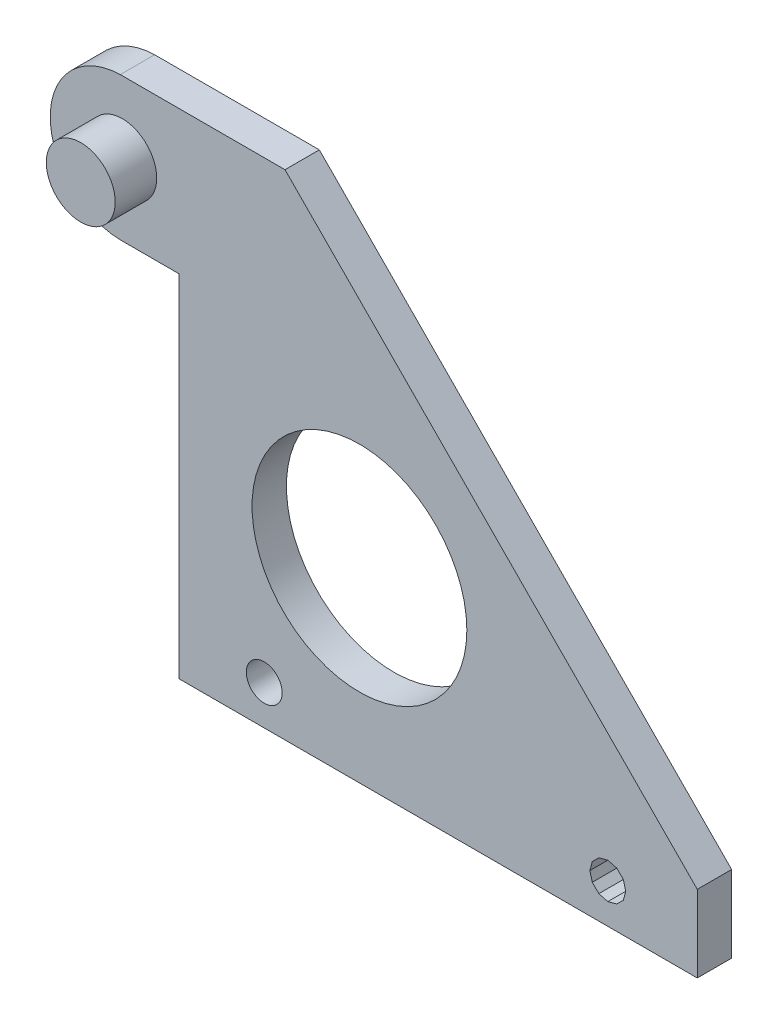
ISO-10303-21;
HEADER;
FILE_DESCRIPTION(('STEP AP214'),'2;1');
FILE_NAME('part.step','',(''),(''),'','','');
FILE_SCHEMA(('AUTOMOTIVE_DESIGN { 1 0 10303 214 1 1 1 1 }'));
ENDSEC;
DATA;
#1=APPLICATION_CONTEXT('core data for automotive mechanical design processes');
#2=APPLICATION_PROTOCOL_DEFINITION('international standard','automotive_design',2000,#1);
#3=PRODUCT_CONTEXT('',#1,'mechanical');
#4=PRODUCT('Part','Part','',(#3));
#5=PRODUCT_RELATED_PRODUCT_CATEGORY('part','',(#4));
#6=PRODUCT_DEFINITION_FORMATION('','',#4);
#7=PRODUCT_DEFINITION_CONTEXT('part definition',#1,'design');
#8=PRODUCT_DEFINITION('design','',#6,#7);
#9=PRODUCT_DEFINITION_SHAPE('','',#8);
#10=(LENGTH_UNIT() NAMED_UNIT(*) SI_UNIT(.MILLI.,.METRE.));
#11=(NAMED_UNIT(*) PLANE_ANGLE_UNIT() SI_UNIT($,.RADIAN.));
#12=(NAMED_UNIT(*) SI_UNIT($,.STERADIAN.) SOLID_ANGLE_UNIT());
#13=UNCERTAINTY_MEASURE_WITH_UNIT(LENGTH_MEASURE(1.E-05),#10,'distance_accuracy_value','');
#14=(GEOMETRIC_REPRESENTATION_CONTEXT(3) GLOBAL_UNCERTAINTY_ASSIGNED_CONTEXT((#13)) GLOBAL_UNIT_ASSIGNED_CONTEXT((#10,
#11,#12)) REPRESENTATION_CONTEXT('',''));
#15=CARTESIAN_POINT('',(0.,0.,0.));
#16=DIRECTION('',(0.,0.,1.));
#17=DIRECTION('',(1.,0.,0.));
#18=AXIS2_PLACEMENT_3D('',#15,#16,#17);
#19=CARTESIAN_POINT('',(-56.2999993562698,-5.49999997019768,0.));
#20=DIRECTION('',(-1.,0.,0.));
#21=DIRECTION('',(0.,0.,1.));
#22=AXIS2_PLACEMENT_3D('',#19,#20,#21);
#23=PLANE('',#22);
#24=DIRECTION('',(0.,-1.,0.));
#25=VECTOR('',#24,1.);
#26=CARTESIAN_POINT('',(-56.2999993562698,-5.49999997019768,2.40000011399388));
#27=LINE('',#26,#25);
#28=CARTESIAN_POINT('',(-56.2999993562698,-5.49999997019768,2.40000011399388));
#29=VERTEX_POINT('',#28);
#30=CARTESIAN_POINT('',(-56.2999993562698,-29.9999993294477,2.40000011399388));
#31=VERTEX_POINT('',#30);
#32=EDGE_CURVE('E348',#29,#31,#27,.T.);
#33=ORIENTED_EDGE('',*,*,#32,.F.);
#34=DIRECTION('',(0.,0.,1.));
#35=VECTOR('',#34,1.);
#36=CARTESIAN_POINT('',(-56.2999993562698,-5.49999997019768,0.));
#37=LINE('',#36,#35);
#38=CARTESIAN_POINT('',(-56.2999993562698,-5.49999997019768,0.));
#39=VERTEX_POINT('',#38);
#40=EDGE_CURVE('E11',#39,#29,#37,.T.);
#41=ORIENTED_EDGE('',*,*,#40,.F.);
#42=DIRECTION('',(0.,-1.,0.));
#43=VECTOR('',#42,1.);
#44=CARTESIAN_POINT('',(-56.2999993562698,-5.49999997019768,0.));
#45=LINE('',#44,#43);
#46=CARTESIAN_POINT('',(-56.2999993562698,-29.9999993294477,0.));
#47=VERTEX_POINT('',#46);
#48=EDGE_CURVE('E360',#39,#47,#45,.T.);
#49=ORIENTED_EDGE('',*,*,#48,.T.);
#50=DIRECTION('',(0.,0.,-1.));
#51=VECTOR('',#50,1.);
#52=CARTESIAN_POINT('',(-56.2999993562698,-29.9999993294477,0.));
#53=LINE('',#52,#51);
#54=EDGE_CURVE('E317',#31,#47,#53,.T.);
#55=ORIENTED_EDGE('',*,*,#54,.F.);
#56=EDGE_LOOP('',(#33,#41,#49,#55));
#57=FACE_BOUND('',#56,.T.);
#58=ADVANCED_FACE('F38',(#57),#23,.T.);
#59=CARTESIAN_POINT('',(-60.4056119918823,-5.49999997019768,0.));
#60=DIRECTION('',(0.,-1.,0.));
#61=DIRECTION('',(1.,0.,0.));
#62=AXIS2_PLACEMENT_3D('',#59,#60,#61);
#63=PLANE('',#62);
#64=DIRECTION('',(1.,0.,0.));
#65=VECTOR('',#64,1.);
#66=CARTESIAN_POINT('',(-60.4056119918823,-5.49999997019768,2.40000011399388));
#67=LINE('',#66,#65);
#68=CARTESIAN_POINT('',(-60.4056119918823,-5.49999997019768,2.40000011399388));
#69=VERTEX_POINT('',#68);
#70=EDGE_CURVE('E373',#69,#29,#67,.T.);
#71=ORIENTED_EDGE('',*,*,#70,.F.);
#72=DIRECTION('',(0.,0.,1.));
#73=VECTOR('',#72,1.);
#74=CARTESIAN_POINT('',(-60.4056119918823,-5.49999997019768,0.));
#75=LINE('',#74,#73);
#76=CARTESIAN_POINT('',(-60.4056119918823,-5.49999997019768,0.));
#77=VERTEX_POINT('',#76);
#78=EDGE_CURVE('E48',#77,#69,#75,.T.);
#79=ORIENTED_EDGE('',*,*,#78,.F.);
#80=DIRECTION('',(1.,0.,0.));
#81=VECTOR('',#80,1.);
#82=CARTESIAN_POINT('',(-60.4056119918823,-5.49999997019768,0.));
#83=LINE('',#82,#81);
#84=EDGE_CURVE('E356',#77,#39,#83,.T.);
#85=ORIENTED_EDGE('',*,*,#84,.T.);
#86=ORIENTED_EDGE('',*,*,#40,.T.);
#87=EDGE_LOOP('',(#71,#79,#85,#86));
#88=FACE_BOUND('',#87,.T.);
#89=ADVANCED_FACE('F421',(#88),#63,.T.);
#90=CARTESIAN_POINT('',(-60.2988634097059,-0.500000081956387,0.));
#91=DIRECTION('',(0.,0.,1.));
#92=DIRECTION('',(1.,0.,0.));
#93=AXIS2_PLACEMENT_3D('',#90,#91,#92);
#94=CYLINDRICAL_SURFACE('',#93,5.00113928442406);
#95=CARTESIAN_POINT('',(-60.2988634097059,-0.500000081956387,2.40000011399388));
#96=DIRECTION('',(0.,0.,1.));
#97=DIRECTION('',(1.,0.,0.));
#98=AXIS2_PLACEMENT_3D('',#95,#96,#97);
#99=CIRCLE('',#98,5.00113928442406);
#100=CARTESIAN_POINT('',(-60.4056119918823,4.4999998062849,2.40000011399388));
#101=VERTEX_POINT('',#100);
#102=EDGE_CURVE('E369',#101,#69,#99,.T.);
#103=ORIENTED_EDGE('',*,*,#102,.F.);
#104=DIRECTION('',(0.,0.,1.));
#105=VECTOR('',#104,1.);
#106=CARTESIAN_POINT('',(-60.4056119918823,4.4999998062849,0.));
#107=LINE('',#106,#105);
#108=CARTESIAN_POINT('',(-60.4056119918823,4.4999998062849,0.));
#109=VERTEX_POINT('',#108);
#110=EDGE_CURVE('E381',#109,#101,#107,.T.);
#111=ORIENTED_EDGE('',*,*,#110,.F.);
#112=CARTESIAN_POINT('',(-60.2988634097059,-0.500000081956387,0.));
#113=DIRECTION('',(0.,0.,1.));
#114=DIRECTION('',(1.,0.,0.));
#115=AXIS2_PLACEMENT_3D('',#112,#113,#114);
#116=CIRCLE('',#115,5.00113928442406);
#117=EDGE_CURVE('E352',#109,#77,#116,.T.);
#118=ORIENTED_EDGE('',*,*,#117,.T.);
#119=ORIENTED_EDGE('',*,*,#78,.T.);
#120=EDGE_LOOP('',(#103,#111,#118,#119));
#121=FACE_BOUND('',#120,.T.);
#122=ADVANCED_FACE('F418',(#121),#94,.T.);
#123=CARTESIAN_POINT('',(-48.9003583788872,4.4999998062849,0.));
#124=DIRECTION('',(0.,1.,0.));
#125=DIRECTION('',(0.,0.,1.));
#126=AXIS2_PLACEMENT_3D('',#123,#124,#125);
#127=PLANE('',#126);
#128=DIRECTION('',(-1.,0.,0.));
#129=VECTOR('',#128,1.);
#130=CARTESIAN_POINT('',(-48.9003583788872,4.4999998062849,2.40000011399388));
#131=LINE('',#130,#129);
#132=CARTESIAN_POINT('',(-48.9003583788872,4.4999998062849,2.40000011399388));
#133=VERTEX_POINT('',#132);
#134=EDGE_CURVE('E366',#133,#101,#131,.T.);
#135=ORIENTED_EDGE('',*,*,#134,.F.);
#136=DIRECTION('',(0.,0.,1.));
#137=VECTOR('',#136,1.);
#138=CARTESIAN_POINT('',(-48.9003583788872,4.4999998062849,0.));
#139=LINE('',#138,#137);
#140=CARTESIAN_POINT('',(-48.9003583788872,4.4999998062849,0.));
#141=VERTEX_POINT('',#140);
#142=EDGE_CURVE('E383',#141,#133,#139,.T.);
#143=ORIENTED_EDGE('',*,*,#142,.F.);
#144=DIRECTION('',(-1.,0.,0.));
#145=VECTOR('',#144,1.);
#146=CARTESIAN_POINT('',(-48.9003583788872,4.4999998062849,0.));
#147=LINE('',#146,#145);
#148=EDGE_CURVE('E347',#141,#109,#147,.T.);
#149=ORIENTED_EDGE('',*,*,#148,.T.);
#150=ORIENTED_EDGE('',*,*,#110,.T.);
#151=EDGE_LOOP('',(#135,#143,#149,#150));
#152=FACE_BOUND('',#151,.T.);
#153=ADVANCED_FACE('F411',(#152),#127,.T.);
#154=CARTESIAN_POINT('',(-20.1000012457371,-24.6347561478615,0.));
#155=DIRECTION('',(0.711176322679684,0.703013682697429,0.));
#156=DIRECTION('',(-0.703013682697429,0.711176322679684,0.));
#157=AXIS2_PLACEMENT_3D('',#154,#155,#156);
#158=PLANE('',#157);
#159=DIRECTION('',(-0.703013682697429,0.711176322679684,0.));
#160=VECTOR('',#159,1.);
#161=CARTESIAN_POINT('',(-20.1000012457371,-24.6347561478615,2.40000011399388));
#162=LINE('',#161,#160);
#163=CARTESIAN_POINT('',(-20.1000012457371,-24.6347561478615,2.40000011399388));
#164=VERTEX_POINT('',#163);
#165=EDGE_CURVE('E342',#164,#133,#162,.T.);
#166=ORIENTED_EDGE('',*,*,#165,.F.);
#167=DIRECTION('',(0.,0.,1.));
#168=VECTOR('',#167,1.);
#169=CARTESIAN_POINT('',(-20.1000012457371,-24.6347561478615,0.));
#170=LINE('',#169,#168);
#171=CARTESIAN_POINT('',(-20.1000012457371,-24.6347561478615,0.));
#172=VERTEX_POINT('',#171);
#173=EDGE_CURVE('E42',#172,#164,#170,.T.);
#174=ORIENTED_EDGE('',*,*,#173,.F.);
#175=DIRECTION('',(-0.703013682697429,0.711176322679684,0.));
#176=VECTOR('',#175,1.);
#177=CARTESIAN_POINT('',(-20.1000012457371,-24.6347561478615,0.));
#178=LINE('',#177,#176);
#179=EDGE_CURVE('E343',#172,#141,#178,.T.);
#180=ORIENTED_EDGE('',*,*,#179,.T.);
#181=ORIENTED_EDGE('',*,*,#142,.T.);
#182=EDGE_LOOP('',(#166,#174,#180,#181));
#183=FACE_BOUND('',#182,.T.);
#184=ADVANCED_FACE('F40',(#183),#158,.T.);
#185=CARTESIAN_POINT('',(-60.2988634097059,-0.500000081956387,0.));
#186=DIRECTION('',(0.,0.,1.));
#187=DIRECTION('',(1.,0.,0.));
#188=AXIS2_PLACEMENT_3D('',#185,#186,#187);
#189=PLANE('',#188);
#190=CARTESIAN_POINT('',(-50.3500010818243,-27.2502419436914,0.));
#191=DIRECTION('',(0.,0.,-1.));
#192=DIRECTION('',(-1.,0.,0.));
#193=AXIS2_PLACEMENT_3D('',#190,#191,#192);
#194=CIRCLE('',#193,1.25275879254651);
#195=CARTESIAN_POINT('',(-51.6027598743708,-27.2502419436914,0.));
#196=VERTEX_POINT('',#195);
#197=EDGE_CURVE('E202',#196,#196,#194,.T.);
#198=ORIENTED_EDGE('',*,*,#197,.F.);
#199=EDGE_LOOP('',(#198));
#200=FACE_BOUND('',#199,.T.);
#201=DIRECTION('',(0.707105346446154,-0.70710821592403,0.));
#202=VECTOR('',#201,1.);
#203=CARTESIAN_POINT('',(-27.4349991232157,-27.8759989887476,0.));
#204=LINE('',#203,#202);
#205=CARTESIAN_POINT('',(-27.4349991232157,-27.8759989887476,0.));
#206=VERTEX_POINT('',#205);
#207=CARTESIAN_POINT('',(-26.9760005176067,-28.3349994570017,0.));
#208=VERTEX_POINT('',#207);
#209=EDGE_CURVE('E180',#206,#208,#204,.T.);
#210=ORIENTED_EDGE('',*,*,#209,.T.);
#211=DIRECTION('',(0.965823467607934,-0.259200751190628,0.));
#212=VECTOR('',#211,1.);
#213=CARTESIAN_POINT('',(-26.9760005176067,-28.3349994570017,0.));
#214=LINE('',#213,#212);
#215=CARTESIAN_POINT('',(-26.350000873208,-28.5030007362366,0.));
#216=VERTEX_POINT('',#215);
#217=EDGE_CURVE('E173',#208,#216,#214,.T.);
#218=ORIENTED_EDGE('',*,*,#217,.T.);
#219=DIRECTION('',(0.965823467607934,0.259200751190628,0.));
#220=VECTOR('',#219,1.);
#221=CARTESIAN_POINT('',(-26.350000873208,-28.5030007362366,0.));
#222=LINE('',#221,#220);
#223=CARTESIAN_POINT('',(-25.7240012288094,-28.3349994570017,0.));
#224=VERTEX_POINT('',#223);
#225=EDGE_CURVE('E183',#216,#224,#222,.T.);
#226=ORIENTED_EDGE('',*,*,#225,.T.);
#227=DIRECTION('',(0.707108215918207,0.707105346451977,0.));
#228=VECTOR('',#227,1.);
#229=CARTESIAN_POINT('',(-25.7240012288094,-28.3349994570017,0.));
#230=LINE('',#229,#228);
#231=CARTESIAN_POINT('',(-25.2649988979101,-27.8759989887476,0.));
#232=VERTEX_POINT('',#231);
#233=EDGE_CURVE('E56',#224,#232,#230,.T.);
#234=ORIENTED_EDGE('',*,*,#233,.T.);
#235=DIRECTION('',(0.25919807048093,0.965824187033522,0.));
#236=VECTOR('',#235,1.);
#237=CARTESIAN_POINT('',(-25.2649988979101,-27.8759989887476,0.));
#238=LINE('',#237,#236);
#239=CARTESIAN_POINT('',(-25.0969994813204,-27.2499993443489,0.));
#240=VERTEX_POINT('',#239);
#241=EDGE_CURVE('E207',#232,#240,#238,.T.);
#242=ORIENTED_EDGE('',*,*,#241,.T.);
#243=DIRECTION('',(-0.25919807048093,0.965824187033522,0.));
#244=VECTOR('',#243,1.);
#245=CARTESIAN_POINT('',(-25.0969994813204,-27.2499993443489,0.));
#246=LINE('',#245,#244);
#247=CARTESIAN_POINT('',(-25.2649988979101,-26.6239996999502,0.));
#248=VERTEX_POINT('',#247);
#249=EDGE_CURVE('E211',#240,#248,#246,.T.);
#250=ORIENTED_EDGE('',*,*,#249,.T.);
#251=DIRECTION('',(-0.707109650652778,0.707103911708672,0.));
#252=VECTOR('',#251,1.);
#253=CARTESIAN_POINT('',(-25.2649988979101,-26.6239996999502,0.));
#254=LINE('',#253,#252);
#255=CARTESIAN_POINT('',(-25.7240012288094,-26.1650010943413,0.));
#256=VERTEX_POINT('',#255);
#257=EDGE_CURVE('E215',#248,#256,#254,.T.);
#258=ORIENTED_EDGE('',*,*,#257,.T.);
#259=DIRECTION('',(-0.966208881366902,0.257760349099157,0.));
#260=VECTOR('',#259,1.);
#261=CARTESIAN_POINT('',(-25.7240012288094,-26.1650010943413,0.));
#262=LINE('',#261,#260);
#263=CARTESIAN_POINT('',(-26.350000873208,-25.9980000555515,0.));
#264=VERTEX_POINT('',#263);
#265=EDGE_CURVE('E219',#256,#264,#262,.T.);
#266=ORIENTED_EDGE('',*,*,#265,.T.);
#267=DIRECTION('',(-0.966208881366902,-0.257760349099157,0.));
#268=VECTOR('',#267,1.);
#269=CARTESIAN_POINT('',(-26.350000873208,-25.9980000555515,0.));
#270=LINE('',#269,#268);
#271=CARTESIAN_POINT('',(-26.9760005176067,-26.1650010943413,0.));
#272=VERTEX_POINT('',#271);
#273=EDGE_CURVE('E223',#264,#272,#270,.T.);
#274=ORIENTED_EDGE('',*,*,#273,.T.);
#275=DIRECTION('',(-0.707106781186547,-0.707106781186547,0.));
#276=VECTOR('',#275,1.);
#277=CARTESIAN_POINT('',(-26.9760005176067,-26.1650010943413,0.));
#278=LINE('',#277,#276);
#279=CARTESIAN_POINT('',(-27.4349991232157,-26.6239996999502,0.));
#280=VERTEX_POINT('',#279);
#281=EDGE_CURVE('E226',#272,#280,#278,.T.);
#282=ORIENTED_EDGE('',*,*,#281,.T.);
#283=DIRECTION('',(-0.257760349099157,-0.966208881366902,0.));
#284=VECTOR('',#283,1.);
#285=CARTESIAN_POINT('',(-27.4349991232157,-26.6239996999502,0.));
#286=LINE('',#285,#284);
#287=CARTESIAN_POINT('',(-27.6020001620054,-27.2499993443489,0.));
#288=VERTEX_POINT('',#287);
#289=EDGE_CURVE('E230',#280,#288,#286,.T.);
#290=ORIENTED_EDGE('',*,*,#289,.T.);
#291=DIRECTION('',(0.257760349099157,-0.966208881366902,0.));
#292=VECTOR('',#291,1.);
#293=CARTESIAN_POINT('',(-27.6020001620054,-27.2499993443489,0.));
#294=LINE('',#293,#292);
#295=EDGE_CURVE('E234',#288,#206,#294,.T.);
#296=ORIENTED_EDGE('',*,*,#295,.T.);
#297=EDGE_LOOP('',(#210,#218,#226,#234,#242,#250,#258,#266,#274,#282,#290,#296));
#298=FACE_BOUND('',#297,.T.);
#299=CARTESIAN_POINT('',(-43.7000021338463,-16.9999397938725,0.));
#300=DIRECTION('',(0.,0.,1.));
#301=DIRECTION('',(1.,0.,0.));
#302=AXIS2_PLACEMENT_3D('',#299,#300,#301);
#303=CIRCLE('',#302,7.50228960936678);
#304=CARTESIAN_POINT('',(-36.1977125244795,-16.9999397938725,0.));
#305=VERTEX_POINT('',#304);
#306=EDGE_CURVE('E313',#305,#305,#303,.T.);
#307=ORIENTED_EDGE('',*,*,#306,.T.);
#308=EDGE_LOOP('',(#307));
#309=FACE_BOUND('',#308,.T.);
#310=ORIENTED_EDGE('',*,*,#179,.F.);
#311=DIRECTION('',(0.,1.,0.));
#312=VECTOR('',#311,1.);
#313=CARTESIAN_POINT('',(-20.1000012457371,-29.9999993294477,0.));
#314=LINE('',#313,#312);
#315=CARTESIAN_POINT('',(-20.1000012457371,-29.9999993294477,0.));
#316=VERTEX_POINT('',#315);
#317=EDGE_CURVE('E338',#316,#172,#314,.T.);
#318=ORIENTED_EDGE('',*,*,#317,.F.);
#319=DIRECTION('',(1.,0.,0.));
#320=VECTOR('',#319,1.);
#321=CARTESIAN_POINT('',(-20.1000012457371,-29.9999993294477,0.));
#322=LINE('',#321,#320);
#323=EDGE_CURVE('E324',#47,#316,#322,.T.);
#324=ORIENTED_EDGE('',*,*,#323,.F.);
#325=ORIENTED_EDGE('',*,*,#48,.F.);
#326=ORIENTED_EDGE('',*,*,#84,.F.);
#327=ORIENTED_EDGE('',*,*,#117,.F.);
#328=ORIENTED_EDGE('',*,*,#148,.F.);
#329=EDGE_LOOP('',(#310,#318,#324,#325,#326,#327,#328));
#330=FACE_BOUND('',#329,.T.);
#331=ADVANCED_FACE('F188',(#200,#298,#309,#330),#189,.F.);
#332=CARTESIAN_POINT('',(-60.2988634097059,-0.500000081956387,2.40000011399388));
#333=DIRECTION('',(0.,0.,1.));
#334=DIRECTION('',(1.,0.,0.));
#335=AXIS2_PLACEMENT_3D('',#332,#333,#334);
#336=PLANE('',#335);
#337=CARTESIAN_POINT('',(-60.2677280873279,-0.499100599907389,2.40000011399388));
#338=DIRECTION('',(0.,0.,1.));
#339=DIRECTION('',(1.,0.,0.));
#340=AXIS2_PLACEMENT_3D('',#337,#338,#339);
#341=CIRCLE('',#340,2.40696441159928);
#342=CARTESIAN_POINT('',(-57.8607636757286,-0.499100599907389,2.40000011399388));
#343=VERTEX_POINT('',#342);
#344=EDGE_CURVE('E683',#343,#343,#341,.T.);
#345=ORIENTED_EDGE('',*,*,#344,.F.);
#346=EDGE_LOOP('',(#345));
#347=FACE_BOUND('',#346,.T.);
#348=CARTESIAN_POINT('',(-50.3500010818243,-27.2502419436914,2.40000011399388));
#349=DIRECTION('',(0.,0.,-1.));
#350=DIRECTION('',(-1.,0.,0.));
#351=AXIS2_PLACEMENT_3D('',#348,#349,#350);
#352=CIRCLE('',#351,1.25275879254651);
#353=CARTESIAN_POINT('',(-51.6027598743708,-27.2502419436914,2.40000011399388));
#354=VERTEX_POINT('',#353);
#355=EDGE_CURVE('E242',#354,#354,#352,.T.);
#356=ORIENTED_EDGE('',*,*,#355,.T.);
#357=EDGE_LOOP('',(#356));
#358=FACE_BOUND('',#357,.T.);
#359=DIRECTION('',(0.965823467607934,-0.259200751190628,0.));
#360=VECTOR('',#359,1.);
#361=CARTESIAN_POINT('',(-26.9760005176067,-28.3349994570017,2.40000011399388));
#362=LINE('',#361,#360);
#363=CARTESIAN_POINT('',(-26.9760005176067,-28.3349994570017,2.40000011399388));
#364=VERTEX_POINT('',#363);
#365=CARTESIAN_POINT('',(-26.350000873208,-28.5030007362366,2.40000011399388));
#366=VERTEX_POINT('',#365);
#367=EDGE_CURVE('E64',#364,#366,#362,.T.);
#368=ORIENTED_EDGE('',*,*,#367,.F.);
#369=DIRECTION('',(0.707105346446154,-0.70710821592403,0.));
#370=VECTOR('',#369,1.);
#371=CARTESIAN_POINT('',(-27.4349991232157,-27.8759989887476,2.40000011399388));
#372=LINE('',#371,#370);
#373=CARTESIAN_POINT('',(-27.4349991232157,-27.8759989887476,2.40000011399388));
#374=VERTEX_POINT('',#373);
#375=EDGE_CURVE('E193',#374,#364,#372,.T.);
#376=ORIENTED_EDGE('',*,*,#375,.F.);
#377=DIRECTION('',(0.257760349099157,-0.966208881366902,0.));
#378=VECTOR('',#377,1.);
#379=CARTESIAN_POINT('',(-27.6020001620054,-27.2499993443489,2.40000011399388));
#380=LINE('',#379,#378);
#381=CARTESIAN_POINT('',(-27.6020001620054,-27.2499993443489,2.40000011399388));
#382=VERTEX_POINT('',#381);
#383=EDGE_CURVE('E199',#382,#374,#380,.T.);
#384=ORIENTED_EDGE('',*,*,#383,.F.);
#385=DIRECTION('',(-0.257760349099157,-0.966208881366902,0.));
#386=VECTOR('',#385,1.);
#387=CARTESIAN_POINT('',(-27.4349991232157,-26.6239996999502,2.40000011399388));
#388=LINE('',#387,#386);
#389=CARTESIAN_POINT('',(-27.4349991232157,-26.6239996999502,2.40000011399388));
#390=VERTEX_POINT('',#389);
#391=EDGE_CURVE('E273',#390,#382,#388,.T.);
#392=ORIENTED_EDGE('',*,*,#391,.F.);
#393=DIRECTION('',(-0.707106781186547,-0.707106781186547,0.));
#394=VECTOR('',#393,1.);
#395=CARTESIAN_POINT('',(-26.9760005176067,-26.1650010943413,2.40000011399388));
#396=LINE('',#395,#394);
#397=CARTESIAN_POINT('',(-26.9760005176067,-26.1650010943413,2.40000011399388));
#398=VERTEX_POINT('',#397);
#399=EDGE_CURVE('E269',#398,#390,#396,.T.);
#400=ORIENTED_EDGE('',*,*,#399,.F.);
#401=DIRECTION('',(-0.966208881366902,-0.257760349099157,0.));
#402=VECTOR('',#401,1.);
#403=CARTESIAN_POINT('',(-26.350000873208,-25.9980000555515,2.40000011399388));
#404=LINE('',#403,#402);
#405=CARTESIAN_POINT('',(-26.350000873208,-25.9980000555515,2.40000011399388));
#406=VERTEX_POINT('',#405);
#407=EDGE_CURVE('E265',#406,#398,#404,.T.);
#408=ORIENTED_EDGE('',*,*,#407,.F.);
#409=DIRECTION('',(-0.966208881366902,0.257760349099157,0.));
#410=VECTOR('',#409,1.);
#411=CARTESIAN_POINT('',(-25.7240012288094,-26.1650010943413,2.40000011399388));
#412=LINE('',#411,#410);
#413=CARTESIAN_POINT('',(-25.7240012288094,-26.1650010943413,2.40000011399388));
#414=VERTEX_POINT('',#413);
#415=EDGE_CURVE('E261',#414,#406,#412,.T.);
#416=ORIENTED_EDGE('',*,*,#415,.F.);
#417=DIRECTION('',(-0.707109650652778,0.707103911708672,0.));
#418=VECTOR('',#417,1.);
#419=CARTESIAN_POINT('',(-25.2649988979101,-26.6239996999502,2.40000011399388));
#420=LINE('',#419,#418);
#421=CARTESIAN_POINT('',(-25.2649988979101,-26.6239996999502,2.40000011399388));
#422=VERTEX_POINT('',#421);
#423=EDGE_CURVE('E257',#422,#414,#420,.T.);
#424=ORIENTED_EDGE('',*,*,#423,.F.);
#425=DIRECTION('',(-0.25919807048093,0.965824187033522,0.));
#426=VECTOR('',#425,1.);
#427=CARTESIAN_POINT('',(-25.0969994813204,-27.2499993443489,2.40000011399388));
#428=LINE('',#427,#426);
#429=CARTESIAN_POINT('',(-25.0969994813204,-27.2499993443489,2.40000011399388));
#430=VERTEX_POINT('',#429);
#431=EDGE_CURVE('E253',#430,#422,#428,.T.);
#432=ORIENTED_EDGE('',*,*,#431,.F.);
#433=DIRECTION('',(0.25919807048093,0.965824187033522,0.));
#434=VECTOR('',#433,1.);
#435=CARTESIAN_POINT('',(-25.2649988979101,-27.8759989887476,2.40000011399388));
#436=LINE('',#435,#434);
#437=CARTESIAN_POINT('',(-25.2649988979101,-27.8759989887476,2.40000011399388));
#438=VERTEX_POINT('',#437);
#439=EDGE_CURVE('E249',#438,#430,#436,.T.);
#440=ORIENTED_EDGE('',*,*,#439,.F.);
#441=DIRECTION('',(0.707108215918207,0.707105346451977,0.));
#442=VECTOR('',#441,1.);
#443=CARTESIAN_POINT('',(-25.7240012288094,-28.3349994570017,2.40000011399388));
#444=LINE('',#443,#442);
#445=CARTESIAN_POINT('',(-25.7240012288094,-28.3349994570017,2.40000011399388));
#446=VERTEX_POINT('',#445);
#447=EDGE_CURVE('E245',#446,#438,#444,.T.);
#448=ORIENTED_EDGE('',*,*,#447,.F.);
#449=DIRECTION('',(0.965823467607934,0.259200751190628,0.));
#450=VECTOR('',#449,1.);
#451=CARTESIAN_POINT('',(-26.350000873208,-28.5030007362366,2.40000011399388));
#452=LINE('',#451,#450);
#453=EDGE_CURVE('E241',#366,#446,#452,.T.);
#454=ORIENTED_EDGE('',*,*,#453,.F.);
#455=EDGE_LOOP('',(#368,#376,#384,#392,#400,#408,#416,#424,#432,#440,#448,#454));
#456=FACE_BOUND('',#455,.T.);
#457=CARTESIAN_POINT('',(-43.7000021338463,-16.9999397938725,2.40000011399388));
#458=DIRECTION('',(0.,0.,1.));
#459=DIRECTION('',(1.,0.,0.));
#460=AXIS2_PLACEMENT_3D('',#457,#458,#459);
#461=CIRCLE('',#460,7.50228960936678);
#462=CARTESIAN_POINT('',(-36.1977125244795,-16.9999397938725,2.40000011399388));
#463=VERTEX_POINT('',#462);
#464=EDGE_CURVE('E283',#463,#463,#461,.T.);
#465=ORIENTED_EDGE('',*,*,#464,.F.);
#466=EDGE_LOOP('',(#465));
#467=FACE_BOUND('',#466,.T.);
#468=ORIENTED_EDGE('',*,*,#32,.T.);
#469=DIRECTION('',(-1.,0.,0.));
#470=VECTOR('',#469,1.);
#471=CARTESIAN_POINT('',(-56.2999993562698,-29.9999993294477,2.40000011399388));
#472=LINE('',#471,#470);
#473=CARTESIAN_POINT('',(-20.1000012457371,-29.9999993294477,2.40000011399388));
#474=VERTEX_POINT('',#473);
#475=EDGE_CURVE('E330',#474,#31,#472,.T.);
#476=ORIENTED_EDGE('',*,*,#475,.F.);
#477=DIRECTION('',(0.,1.,0.));
#478=VECTOR('',#477,1.);
#479=CARTESIAN_POINT('',(-20.1000012457371,-29.9999993294477,2.40000011399388));
#480=LINE('',#479,#478);
#481=EDGE_CURVE('E334',#474,#164,#480,.T.);
#482=ORIENTED_EDGE('',*,*,#481,.T.);
#483=ORIENTED_EDGE('',*,*,#165,.T.);
#484=ORIENTED_EDGE('',*,*,#134,.T.);
#485=ORIENTED_EDGE('',*,*,#102,.T.);
#486=ORIENTED_EDGE('',*,*,#70,.T.);
#487=EDGE_LOOP('',(#468,#476,#482,#483,#484,#485,#486));
#488=FACE_BOUND('',#487,.T.);
#489=ADVANCED_FACE('F398',(#347,#358,#456,#467,#488),#336,.T.);
#490=CARTESIAN_POINT('',(-20.1000012457371,-29.9999993294477,2.40000011399388));
#491=DIRECTION('',(-1.,0.,0.));
#492=DIRECTION('',(0.,0.,1.));
#493=AXIS2_PLACEMENT_3D('',#490,#491,#492);
#494=PLANE('',#493);
#495=ORIENTED_EDGE('',*,*,#173,.T.);
#496=ORIENTED_EDGE('',*,*,#481,.F.);
#497=DIRECTION('',(0.,0.,1.));
#498=VECTOR('',#497,1.);
#499=CARTESIAN_POINT('',(-20.1000012457371,-29.9999993294477,2.40000011399388));
#500=LINE('',#499,#498);
#501=EDGE_CURVE('E327',#316,#474,#500,.T.);
#502=ORIENTED_EDGE('',*,*,#501,.F.);
#503=ORIENTED_EDGE('',*,*,#317,.T.);
#504=EDGE_LOOP('',(#495,#496,#502,#503));
#505=FACE_BOUND('',#504,.T.);
#506=ADVANCED_FACE('F392',(#505),#494,.F.);
#507=CARTESIAN_POINT('',(0.,-29.9999993294477,0.));
#508=DIRECTION('',(0.,1.,0.));
#509=DIRECTION('',(0.,0.,1.));
#510=AXIS2_PLACEMENT_3D('',#507,#508,#509);
#511=PLANE('',#510);
#512=ORIENTED_EDGE('',*,*,#54,.T.);
#513=ORIENTED_EDGE('',*,*,#323,.T.);
#514=ORIENTED_EDGE('',*,*,#501,.T.);
#515=ORIENTED_EDGE('',*,*,#475,.T.);
#516=EDGE_LOOP('',(#512,#513,#514,#515));
#517=FACE_BOUND('',#516,.T.);
#518=ADVANCED_FACE('F402',(#517),#511,.F.);
#519=CARTESIAN_POINT('',(-43.7000021338463,-16.9999397938725,0.));
#520=DIRECTION('',(0.,0.,1.));
#521=DIRECTION('',(1.,0.,0.));
#522=AXIS2_PLACEMENT_3D('',#519,#520,#521);
#523=CYLINDRICAL_SURFACE('',#522,7.50228960936678);
#524=ORIENTED_EDGE('',*,*,#306,.F.);
#525=EDGE_LOOP('',(#524));
#526=FACE_BOUND('',#525,.T.);
#527=ORIENTED_EDGE('',*,*,#464,.T.);
#528=EDGE_LOOP('',(#527));
#529=FACE_BOUND('',#528,.T.);
#530=ADVANCED_FACE('F474',(#526,#529),#523,.F.);
#531=CARTESIAN_POINT('',(-26.9760005176067,-28.3349994570017,0.));
#532=DIRECTION('',(-0.259200751190628,-0.965823467607934,0.));
#533=DIRECTION('',(0.965823467607934,-0.259200751190628,0.));
#534=AXIS2_PLACEMENT_3D('',#531,#532,#533);
#535=PLANE('',#534);
#536=ORIENTED_EDGE('',*,*,#367,.T.);
#537=DIRECTION('',(0.,0.,1.));
#538=VECTOR('',#537,1.);
#539=CARTESIAN_POINT('',(-26.350000873208,-28.5030007362366,0.));
#540=LINE('',#539,#538);
#541=EDGE_CURVE('E169',#216,#366,#540,.T.);
#542=ORIENTED_EDGE('',*,*,#541,.F.);
#543=ORIENTED_EDGE('',*,*,#217,.F.);
#544=DIRECTION('',(0.,0.,1.));
#545=VECTOR('',#544,1.);
#546=CARTESIAN_POINT('',(-26.9760005176067,-28.3349994570017,0.));
#547=LINE('',#546,#545);
#548=EDGE_CURVE('E280',#208,#364,#547,.T.);
#549=ORIENTED_EDGE('',*,*,#548,.T.);
#550=EDGE_LOOP('',(#536,#542,#543,#549));
#551=FACE_BOUND('',#550,.T.);
#552=ADVANCED_FACE('F171',(#551),#535,.F.);
#553=CARTESIAN_POINT('',(-27.4349991232157,-27.8759989887476,0.));
#554=DIRECTION('',(-0.70710821592403,-0.707105346446154,0.));
#555=DIRECTION('',(0.707105346446154,-0.70710821592403,0.));
#556=AXIS2_PLACEMENT_3D('',#553,#554,#555);
#557=PLANE('',#556);
#558=ORIENTED_EDGE('',*,*,#375,.T.);
#559=ORIENTED_EDGE('',*,*,#548,.F.);
#560=ORIENTED_EDGE('',*,*,#209,.F.);
#561=DIRECTION('',(0.,0.,1.));
#562=VECTOR('',#561,1.);
#563=CARTESIAN_POINT('',(-27.4349991232157,-27.8759989887476,0.));
#564=LINE('',#563,#562);
#565=EDGE_CURVE('E284',#206,#374,#564,.T.);
#566=ORIENTED_EDGE('',*,*,#565,.T.);
#567=EDGE_LOOP('',(#558,#559,#560,#566));
#568=FACE_BOUND('',#567,.T.);
#569=ADVANCED_FACE('F490',(#568),#557,.F.);
#570=CARTESIAN_POINT('',(-27.6020001620054,-27.2499993443489,0.));
#571=DIRECTION('',(-0.966208881366902,-0.257760349099157,0.));
#572=DIRECTION('',(0.257760349099157,-0.966208881366903,0.));
#573=AXIS2_PLACEMENT_3D('',#570,#571,#572);
#574=PLANE('',#573);
#575=ORIENTED_EDGE('',*,*,#383,.T.);
#576=ORIENTED_EDGE('',*,*,#565,.F.);
#577=ORIENTED_EDGE('',*,*,#295,.F.);
#578=DIRECTION('',(0.,0.,1.));
#579=VECTOR('',#578,1.);
#580=CARTESIAN_POINT('',(-27.6020001620054,-27.2499993443489,0.));
#581=LINE('',#580,#579);
#582=EDGE_CURVE('E287',#288,#382,#581,.T.);
#583=ORIENTED_EDGE('',*,*,#582,.T.);
#584=EDGE_LOOP('',(#575,#576,#577,#583));
#585=FACE_BOUND('',#584,.T.);
#586=ADVANCED_FACE('F498',(#585),#574,.F.);
#587=CARTESIAN_POINT('',(-27.4349991232157,-26.6239996999502,0.));
#588=DIRECTION('',(-0.966208881366902,0.257760349099157,0.));
#589=DIRECTION('',(-0.257760349099157,-0.966208881366903,0.));
#590=AXIS2_PLACEMENT_3D('',#587,#588,#589);
#591=PLANE('',#590);
#592=ORIENTED_EDGE('',*,*,#391,.T.);
#593=ORIENTED_EDGE('',*,*,#582,.F.);
#594=ORIENTED_EDGE('',*,*,#289,.F.);
#595=DIRECTION('',(0.,0.,1.));
#596=VECTOR('',#595,1.);
#597=CARTESIAN_POINT('',(-27.4349991232157,-26.6239996999502,0.));
#598=LINE('',#597,#596);
#599=EDGE_CURVE('E290',#280,#390,#598,.T.);
#600=ORIENTED_EDGE('',*,*,#599,.T.);
#601=EDGE_LOOP('',(#592,#593,#594,#600));
#602=FACE_BOUND('',#601,.T.);
#603=ADVANCED_FACE('F507',(#602),#591,.F.);
#604=CARTESIAN_POINT('',(-26.9760005176067,-26.1650010943413,0.));
#605=DIRECTION('',(-0.707106781186547,0.707106781186547,0.));
#606=DIRECTION('',(-0.707106781186548,-0.707106781186548,0.));
#607=AXIS2_PLACEMENT_3D('',#604,#605,#606);
#608=PLANE('',#607);
#609=ORIENTED_EDGE('',*,*,#399,.T.);
#610=ORIENTED_EDGE('',*,*,#599,.F.);
#611=ORIENTED_EDGE('',*,*,#281,.F.);
#612=DIRECTION('',(0.,0.,1.));
#613=VECTOR('',#612,1.);
#614=CARTESIAN_POINT('',(-26.9760005176067,-26.1650010943413,0.));
#615=LINE('',#614,#613);
#616=EDGE_CURVE('E293',#272,#398,#615,.T.);
#617=ORIENTED_EDGE('',*,*,#616,.T.);
#618=EDGE_LOOP('',(#609,#610,#611,#617));
#619=FACE_BOUND('',#618,.T.);
#620=ADVANCED_FACE('F516',(#619),#608,.F.);
#621=CARTESIAN_POINT('',(-26.350000873208,-25.9980000555515,0.));
#622=DIRECTION('',(-0.257760349099157,0.966208881366902,0.));
#623=DIRECTION('',(-0.966208881366903,-0.257760349099157,0.));
#624=AXIS2_PLACEMENT_3D('',#621,#622,#623);
#625=PLANE('',#624);
#626=ORIENTED_EDGE('',*,*,#407,.T.);
#627=ORIENTED_EDGE('',*,*,#616,.F.);
#628=ORIENTED_EDGE('',*,*,#273,.F.);
#629=DIRECTION('',(0.,0.,1.));
#630=VECTOR('',#629,1.);
#631=CARTESIAN_POINT('',(-26.350000873208,-25.9980000555515,0.));
#632=LINE('',#631,#630);
#633=EDGE_CURVE('E296',#264,#406,#632,.T.);
#634=ORIENTED_EDGE('',*,*,#633,.T.);
#635=EDGE_LOOP('',(#626,#627,#628,#634));
#636=FACE_BOUND('',#635,.T.);
#637=ADVANCED_FACE('F525',(#636),#625,.F.);
#638=CARTESIAN_POINT('',(-25.7240012288094,-26.1650010943413,0.));
#639=DIRECTION('',(0.257760349099157,0.966208881366902,0.));
#640=DIRECTION('',(-0.966208881366903,0.257760349099157,0.));
#641=AXIS2_PLACEMENT_3D('',#638,#639,#640);
#642=PLANE('',#641);
#643=ORIENTED_EDGE('',*,*,#415,.T.);
#644=ORIENTED_EDGE('',*,*,#633,.F.);
#645=ORIENTED_EDGE('',*,*,#265,.F.);
#646=DIRECTION('',(0.,0.,1.));
#647=VECTOR('',#646,1.);
#648=CARTESIAN_POINT('',(-25.7240012288094,-26.1650010943413,0.));
#649=LINE('',#648,#647);
#650=EDGE_CURVE('E299',#256,#414,#649,.T.);
#651=ORIENTED_EDGE('',*,*,#650,.T.);
#652=EDGE_LOOP('',(#643,#644,#645,#651));
#653=FACE_BOUND('',#652,.T.);
#654=ADVANCED_FACE('F534',(#653),#642,.F.);
#655=CARTESIAN_POINT('',(-25.2649988979101,-26.6239996999502,0.));
#656=DIRECTION('',(0.707103911708672,0.707109650652778,0.));
#657=DIRECTION('',(-0.707109650652778,0.707103911708672,0.));
#658=AXIS2_PLACEMENT_3D('',#655,#656,#657);
#659=PLANE('',#658);
#660=ORIENTED_EDGE('',*,*,#423,.T.);
#661=ORIENTED_EDGE('',*,*,#650,.F.);
#662=ORIENTED_EDGE('',*,*,#257,.F.);
#663=DIRECTION('',(0.,0.,1.));
#664=VECTOR('',#663,1.);
#665=CARTESIAN_POINT('',(-25.2649988979101,-26.6239996999502,0.));
#666=LINE('',#665,#664);
#667=EDGE_CURVE('E302',#248,#422,#666,.T.);
#668=ORIENTED_EDGE('',*,*,#667,.T.);
#669=EDGE_LOOP('',(#660,#661,#662,#668));
#670=FACE_BOUND('',#669,.T.);
#671=ADVANCED_FACE('F543',(#670),#659,.F.);
#672=CARTESIAN_POINT('',(-25.0969994813204,-27.2499993443489,0.));
#673=DIRECTION('',(0.965824187033522,0.25919807048093,0.));
#674=DIRECTION('',(-0.25919807048093,0.965824187033522,0.));
#675=AXIS2_PLACEMENT_3D('',#672,#673,#674);
#676=PLANE('',#675);
#677=ORIENTED_EDGE('',*,*,#431,.T.);
#678=ORIENTED_EDGE('',*,*,#667,.F.);
#679=ORIENTED_EDGE('',*,*,#249,.F.);
#680=DIRECTION('',(0.,0.,1.));
#681=VECTOR('',#680,1.);
#682=CARTESIAN_POINT('',(-25.0969994813204,-27.2499993443489,0.));
#683=LINE('',#682,#681);
#684=EDGE_CURVE('E305',#240,#430,#683,.T.);
#685=ORIENTED_EDGE('',*,*,#684,.T.);
#686=EDGE_LOOP('',(#677,#678,#679,#685));
#687=FACE_BOUND('',#686,.T.);
#688=ADVANCED_FACE('F552',(#687),#676,.F.);
#689=CARTESIAN_POINT('',(-25.2649988979101,-27.8759989887476,0.));
#690=DIRECTION('',(0.965824187033522,-0.25919807048093,0.));
#691=DIRECTION('',(0.25919807048093,0.965824187033522,0.));
#692=AXIS2_PLACEMENT_3D('',#689,#690,#691);
#693=PLANE('',#692);
#694=ORIENTED_EDGE('',*,*,#439,.T.);
#695=ORIENTED_EDGE('',*,*,#684,.F.);
#696=ORIENTED_EDGE('',*,*,#241,.F.);
#697=DIRECTION('',(0.,0.,1.));
#698=VECTOR('',#697,1.);
#699=CARTESIAN_POINT('',(-25.2649988979101,-27.8759989887476,0.));
#700=LINE('',#699,#698);
#701=EDGE_CURVE('E308',#232,#438,#700,.T.);
#702=ORIENTED_EDGE('',*,*,#701,.T.);
#703=EDGE_LOOP('',(#694,#695,#696,#702));
#704=FACE_BOUND('',#703,.T.);
#705=ADVANCED_FACE('F561',(#704),#693,.F.);
#706=CARTESIAN_POINT('',(-25.7240012288094,-28.3349994570017,0.));
#707=DIRECTION('',(0.707105346451977,-0.707108215918207,0.));
#708=DIRECTION('',(0.707108215918207,0.707105346451977,0.));
#709=AXIS2_PLACEMENT_3D('',#706,#707,#708);
#710=PLANE('',#709);
#711=ORIENTED_EDGE('',*,*,#447,.T.);
#712=ORIENTED_EDGE('',*,*,#701,.F.);
#713=ORIENTED_EDGE('',*,*,#233,.F.);
#714=DIRECTION('',(0.,0.,1.));
#715=VECTOR('',#714,1.);
#716=CARTESIAN_POINT('',(-25.7240012288094,-28.3349994570017,0.));
#717=LINE('',#716,#715);
#718=EDGE_CURVE('E179',#224,#446,#717,.T.);
#719=ORIENTED_EDGE('',*,*,#718,.T.);
#720=EDGE_LOOP('',(#711,#712,#713,#719));
#721=FACE_BOUND('',#720,.T.);
#722=ADVANCED_FACE('F570',(#721),#710,.F.);
#723=CARTESIAN_POINT('',(-26.350000873208,-28.5030007362366,0.));
#724=DIRECTION('',(0.259200751190628,-0.965823467607934,0.));
#725=DIRECTION('',(0.965823467607934,0.259200751190628,0.));
#726=AXIS2_PLACEMENT_3D('',#723,#724,#725);
#727=PLANE('',#726);
#728=ORIENTED_EDGE('',*,*,#453,.T.);
#729=ORIENTED_EDGE('',*,*,#718,.F.);
#730=ORIENTED_EDGE('',*,*,#225,.F.);
#731=ORIENTED_EDGE('',*,*,#541,.T.);
#732=EDGE_LOOP('',(#728,#729,#730,#731));
#733=FACE_BOUND('',#732,.T.);
#734=ADVANCED_FACE('F184',(#733),#727,.F.);
#735=CARTESIAN_POINT('',(-50.3500010818243,-27.2502419436914,2.40000011399388));
#736=DIRECTION('',(0.,0.,-1.));
#737=DIRECTION('',(-1.,0.,0.));
#738=AXIS2_PLACEMENT_3D('',#735,#736,#737);
#739=CYLINDRICAL_SURFACE('',#738,1.25275879254651);
#740=ORIENTED_EDGE('',*,*,#355,.F.);
#741=EDGE_LOOP('',(#740));
#742=FACE_BOUND('',#741,.T.);
#743=ORIENTED_EDGE('',*,*,#197,.T.);
#744=EDGE_LOOP('',(#743));
#745=FACE_BOUND('',#744,.T.);
#746=ADVANCED_FACE('F585',(#742,#745),#739,.F.);
#747=CARTESIAN_POINT('',(-60.2677280873279,-0.499100599907389,5.30000011399388));
#748=DIRECTION('',(0.,0.,-1.));
#749=DIRECTION('',(-1.,0.,0.));
#750=AXIS2_PLACEMENT_3D('',#747,#748,#749);
#751=CYLINDRICAL_SURFACE('',#750,2.40696441159928);
#752=CARTESIAN_POINT('',(-60.2677280873279,-0.499100599907389,5.30000011399388));
#753=DIRECTION('',(0.,0.,1.));
#754=DIRECTION('',(1.,0.,0.));
#755=AXIS2_PLACEMENT_3D('',#752,#753,#754);
#756=CIRCLE('',#755,2.40696441159928);
#757=CARTESIAN_POINT('',(-57.8607636757286,-0.499100599907389,5.30000011399388));
#758=VERTEX_POINT('',#757);
#759=EDGE_CURVE('E681',#758,#758,#756,.T.);
#760=ORIENTED_EDGE('',*,*,#759,.F.);
#761=EDGE_LOOP('',(#760));
#762=FACE_BOUND('',#761,.T.);
#763=ORIENTED_EDGE('',*,*,#344,.T.);
#764=EDGE_LOOP('',(#763));
#765=FACE_BOUND('',#764,.T.);
#766=ADVANCED_FACE('F592',(#762,#765),#751,.T.);
#767=CARTESIAN_POINT('',(-60.2677280873279,-0.499100599907389,5.30000011399388));
#768=DIRECTION('',(0.,0.,1.));
#769=DIRECTION('',(1.,0.,0.));
#770=AXIS2_PLACEMENT_3D('',#767,#768,#769);
#771=PLANE('',#770);
#772=ORIENTED_EDGE('',*,*,#759,.T.);
#773=EDGE_LOOP('',(#772));
#774=FACE_BOUND('',#773,.T.);
#775=ADVANCED_FACE('F600',(#774),#771,.T.);
#776=CLOSED_SHELL('',(#58,#89,#122,#153,#184,#331,#489,#506,#518,#530,#552,#569,#586,#603,#620,
#637,#654,#671,#688,#705,#722,#734,#746,#766,#775));
#777=MANIFOLD_SOLID_BREP('B2',#776);
#778=ADVANCED_BREP_SHAPE_REPRESENTATION('',(#18,#777),#14);
#779=SHAPE_DEFINITION_REPRESENTATION(#9,#778);
ENDSEC;
END-ISO-10303-21;
